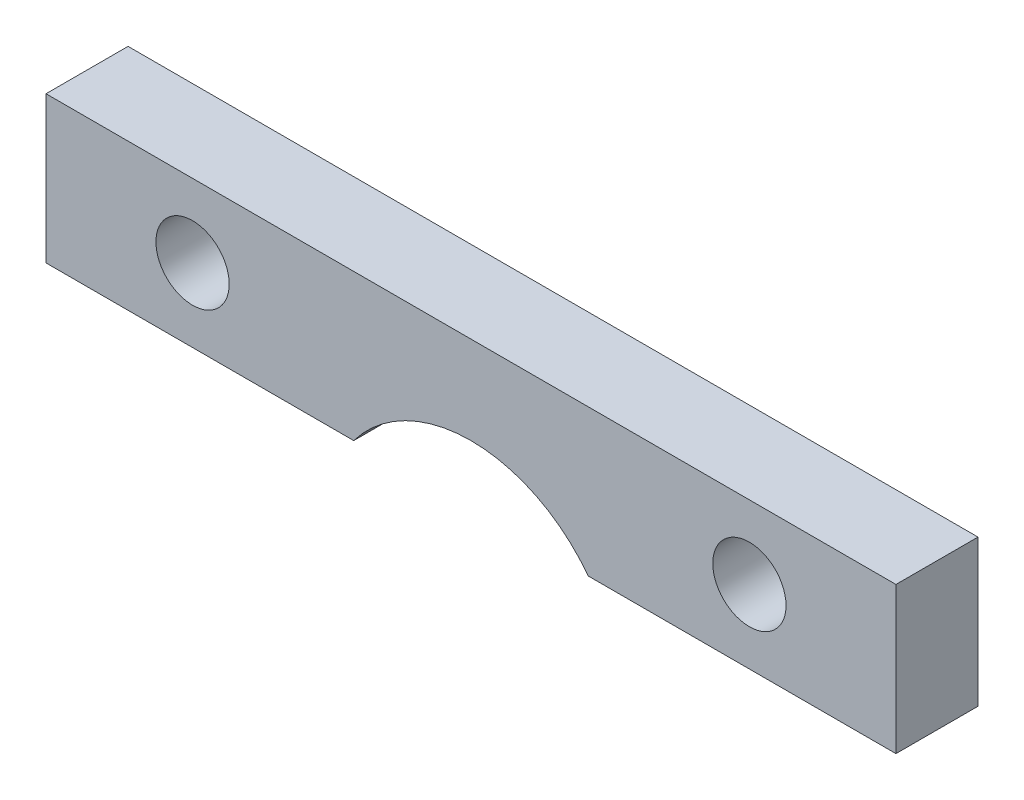
ISO-10303-21;
HEADER;
FILE_DESCRIPTION(('STEP AP214'),'2;1');
FILE_NAME('part.step','',(''),(''),'','','');
FILE_SCHEMA(('AUTOMOTIVE_DESIGN { 1 0 10303 214 1 1 1 1 }'));
ENDSEC;
DATA;
#1=APPLICATION_CONTEXT('core data for automotive mechanical design processes');
#2=APPLICATION_PROTOCOL_DEFINITION('international standard','automotive_design',2000,#1);
#3=PRODUCT_CONTEXT('',#1,'mechanical');
#4=PRODUCT('Part','Part','',(#3));
#5=PRODUCT_RELATED_PRODUCT_CATEGORY('part','',(#4));
#6=PRODUCT_DEFINITION_FORMATION('','',#4);
#7=PRODUCT_DEFINITION_CONTEXT('part definition',#1,'design');
#8=PRODUCT_DEFINITION('design','',#6,#7);
#9=PRODUCT_DEFINITION_SHAPE('','',#8);
#10=(LENGTH_UNIT() NAMED_UNIT(*) SI_UNIT(.MILLI.,.METRE.));
#11=(NAMED_UNIT(*) PLANE_ANGLE_UNIT() SI_UNIT($,.RADIAN.));
#12=(NAMED_UNIT(*) SI_UNIT($,.STERADIAN.) SOLID_ANGLE_UNIT());
#13=UNCERTAINTY_MEASURE_WITH_UNIT(LENGTH_MEASURE(1.E-05),#10,'distance_accuracy_value','');
#14=(GEOMETRIC_REPRESENTATION_CONTEXT(3) GLOBAL_UNCERTAINTY_ASSIGNED_CONTEXT((#13)) GLOBAL_UNIT_ASSIGNED_CONTEXT((#10,
#11,#12)) REPRESENTATION_CONTEXT('',''));
#15=CARTESIAN_POINT('',(0.,0.,0.));
#16=DIRECTION('',(0.,0.,1.));
#17=DIRECTION('',(1.,0.,0.));
#18=AXIS2_PLACEMENT_3D('',#15,#16,#17);
#19=CARTESIAN_POINT('',(36.83,-7.62,7.112));
#20=DIRECTION('',(0.,0.,1.));
#21=DIRECTION('',(1.,0.,0.));
#22=AXIS2_PLACEMENT_3D('',#19,#20,#21);
#23=PLANE('',#22);
#24=CARTESIAN_POINT('',(12.7,6.35,7.112));
#25=DIRECTION('',(0.,0.,1.));
#26=DIRECTION('',(1.,0.,0.));
#27=AXIS2_PLACEMENT_3D('',#24,#25,#26);
#28=CIRCLE('',#27,3.175);
#29=CARTESIAN_POINT('',(15.875,6.35,7.112));
#30=VERTEX_POINT('',#29);
#31=EDGE_CURVE('E140',#30,#30,#28,.T.);
#32=ORIENTED_EDGE('',*,*,#31,.F.);
#33=EDGE_LOOP('',(#32));
#34=FACE_BOUND('',#33,.T.);
#35=DIRECTION('',(0.,-1.,0.));
#36=VECTOR('',#35,1.);
#37=CARTESIAN_POINT('',(0.,0.,7.112));
#38=LINE('',#37,#36);
#39=CARTESIAN_POINT('',(0.,12.7,7.112));
#40=VERTEX_POINT('',#39);
#41=CARTESIAN_POINT('',(0.,0.,7.112));
#42=VERTEX_POINT('',#41);
#43=EDGE_CURVE('E152',#40,#42,#38,.T.);
#44=ORIENTED_EDGE('',*,*,#43,.T.);
#45=DIRECTION('',(1.,0.,0.));
#46=VECTOR('',#45,1.);
#47=CARTESIAN_POINT('',(0.,0.,7.112));
#48=LINE('',#47,#46);
#49=CARTESIAN_POINT('',(26.67,0.,7.112));
#50=VERTEX_POINT('',#49);
#51=EDGE_CURVE('E100',#42,#50,#48,.T.);
#52=ORIENTED_EDGE('',*,*,#51,.T.);
#53=CARTESIAN_POINT('',(36.83,-7.62,7.112));
#54=DIRECTION('',(0.,0.,-1.));
#55=DIRECTION('',(1.,0.,0.));
#56=AXIS2_PLACEMENT_3D('',#53,#54,#55);
#57=CIRCLE('',#56,12.7);
#58=CARTESIAN_POINT('',(46.99,0.,7.112));
#59=VERTEX_POINT('',#58);
#60=EDGE_CURVE('E113',#50,#59,#57,.T.);
#61=ORIENTED_EDGE('',*,*,#60,.T.);
#62=DIRECTION('',(1.,0.,0.));
#63=VECTOR('',#62,1.);
#64=CARTESIAN_POINT('',(46.99,0.,7.112));
#65=LINE('',#64,#63);
#66=CARTESIAN_POINT('',(73.66,0.,7.112));
#67=VERTEX_POINT('',#66);
#68=EDGE_CURVE('E107',#59,#67,#65,.T.);
#69=ORIENTED_EDGE('',*,*,#68,.T.);
#70=DIRECTION('',(0.,1.,0.));
#71=VECTOR('',#70,1.);
#72=CARTESIAN_POINT('',(73.66,0.,7.112));
#73=LINE('',#72,#71);
#74=CARTESIAN_POINT('',(73.66,12.7,7.112));
#75=VERTEX_POINT('',#74);
#76=EDGE_CURVE('E111',#67,#75,#73,.T.);
#77=ORIENTED_EDGE('',*,*,#76,.T.);
#78=DIRECTION('',(-1.,0.,0.));
#79=VECTOR('',#78,1.);
#80=CARTESIAN_POINT('',(0.,12.7,7.112));
#81=LINE('',#80,#79);
#82=EDGE_CURVE('E63',#75,#40,#81,.T.);
#83=ORIENTED_EDGE('',*,*,#82,.T.);
#84=EDGE_LOOP('',(#44,#52,#61,#69,#77,#83));
#85=FACE_BOUND('',#84,.T.);
#86=CARTESIAN_POINT('',(60.96,6.35,7.112));
#87=DIRECTION('',(0.,0.,1.));
#88=DIRECTION('',(1.,0.,0.));
#89=AXIS2_PLACEMENT_3D('',#86,#87,#88);
#90=CIRCLE('',#89,3.175);
#91=CARTESIAN_POINT('',(64.135,6.35,7.112));
#92=VERTEX_POINT('',#91);
#93=EDGE_CURVE('E198',#92,#92,#90,.T.);
#94=ORIENTED_EDGE('',*,*,#93,.F.);
#95=EDGE_LOOP('',(#94));
#96=FACE_BOUND('',#95,.T.);
#97=ADVANCED_FACE('F45',(#34,#85,#96),#23,.T.);
#98=CARTESIAN_POINT('',(36.83,-7.62,0.));
#99=DIRECTION('',(0.,0.,1.));
#100=DIRECTION('',(1.,0.,0.));
#101=AXIS2_PLACEMENT_3D('',#98,#99,#100);
#102=PLANE('',#101);
#103=DIRECTION('',(0.,-1.,0.));
#104=VECTOR('',#103,1.);
#105=CARTESIAN_POINT('',(0.,0.,0.));
#106=LINE('',#105,#104);
#107=CARTESIAN_POINT('',(0.,12.7,0.));
#108=VERTEX_POINT('',#107);
#109=CARTESIAN_POINT('',(0.,0.,0.));
#110=VERTEX_POINT('',#109);
#111=EDGE_CURVE('E135',#108,#110,#106,.T.);
#112=ORIENTED_EDGE('',*,*,#111,.F.);
#113=DIRECTION('',(-1.,0.,0.));
#114=VECTOR('',#113,1.);
#115=CARTESIAN_POINT('',(0.,12.7,0.));
#116=LINE('',#115,#114);
#117=CARTESIAN_POINT('',(73.66,12.7,0.));
#118=VERTEX_POINT('',#117);
#119=EDGE_CURVE('E92',#118,#108,#116,.T.);
#120=ORIENTED_EDGE('',*,*,#119,.F.);
#121=DIRECTION('',(0.,1.,0.));
#122=VECTOR('',#121,1.);
#123=CARTESIAN_POINT('',(73.66,0.,0.));
#124=LINE('',#123,#122);
#125=CARTESIAN_POINT('',(73.66,0.,0.));
#126=VERTEX_POINT('',#125);
#127=EDGE_CURVE('E86',#126,#118,#124,.T.);
#128=ORIENTED_EDGE('',*,*,#127,.F.);
#129=DIRECTION('',(1.,0.,0.));
#130=VECTOR('',#129,1.);
#131=CARTESIAN_POINT('',(46.99,0.,0.));
#132=LINE('',#131,#130);
#133=CARTESIAN_POINT('',(46.99,0.,0.));
#134=VERTEX_POINT('',#133);
#135=EDGE_CURVE('E122',#134,#126,#132,.T.);
#136=ORIENTED_EDGE('',*,*,#135,.F.);
#137=CARTESIAN_POINT('',(36.83,-7.62,0.));
#138=DIRECTION('',(0.,0.,-1.));
#139=DIRECTION('',(1.,0.,0.));
#140=AXIS2_PLACEMENT_3D('',#137,#138,#139);
#141=CIRCLE('',#140,12.7);
#142=CARTESIAN_POINT('',(26.67,0.,0.));
#143=VERTEX_POINT('',#142);
#144=EDGE_CURVE('E143',#143,#134,#141,.T.);
#145=ORIENTED_EDGE('',*,*,#144,.F.);
#146=DIRECTION('',(1.,0.,0.));
#147=VECTOR('',#146,1.);
#148=CARTESIAN_POINT('',(0.,0.,0.));
#149=LINE('',#148,#147);
#150=EDGE_CURVE('E139',#110,#143,#149,.T.);
#151=ORIENTED_EDGE('',*,*,#150,.F.);
#152=EDGE_LOOP('',(#112,#120,#128,#136,#145,#151));
#153=FACE_BOUND('',#152,.T.);
#154=CARTESIAN_POINT('',(12.7,6.35,0.));
#155=DIRECTION('',(0.,0.,1.));
#156=DIRECTION('',(1.,0.,0.));
#157=AXIS2_PLACEMENT_3D('',#154,#155,#156);
#158=CIRCLE('',#157,3.175);
#159=CARTESIAN_POINT('',(15.875,6.35,0.));
#160=VERTEX_POINT('',#159);
#161=EDGE_CURVE('E206',#160,#160,#158,.T.);
#162=ORIENTED_EDGE('',*,*,#161,.T.);
#163=EDGE_LOOP('',(#162));
#164=FACE_BOUND('',#163,.T.);
#165=CARTESIAN_POINT('',(60.96,6.35,0.));
#166=DIRECTION('',(0.,0.,1.));
#167=DIRECTION('',(1.,0.,0.));
#168=AXIS2_PLACEMENT_3D('',#165,#166,#167);
#169=CIRCLE('',#168,3.175);
#170=CARTESIAN_POINT('',(64.135,6.35,0.));
#171=VERTEX_POINT('',#170);
#172=EDGE_CURVE('E201',#171,#171,#169,.T.);
#173=ORIENTED_EDGE('',*,*,#172,.T.);
#174=EDGE_LOOP('',(#173));
#175=FACE_BOUND('',#174,.T.);
#176=ADVANCED_FACE('F165',(#153,#164,#175),#102,.F.);
#177=CARTESIAN_POINT('',(0.,0.,7.112));
#178=DIRECTION('',(1.,0.,0.));
#179=DIRECTION('',(0.,0.,-1.));
#180=AXIS2_PLACEMENT_3D('',#177,#178,#179);
#181=PLANE('',#180);
#182=ORIENTED_EDGE('',*,*,#111,.T.);
#183=DIRECTION('',(0.,0.,-1.));
#184=VECTOR('',#183,1.);
#185=CARTESIAN_POINT('',(0.,0.,7.112));
#186=LINE('',#185,#184);
#187=EDGE_CURVE('E11',#42,#110,#186,.T.);
#188=ORIENTED_EDGE('',*,*,#187,.F.);
#189=ORIENTED_EDGE('',*,*,#43,.F.);
#190=DIRECTION('',(0.,0.,-1.));
#191=VECTOR('',#190,1.);
#192=CARTESIAN_POINT('',(0.,12.7,7.112));
#193=LINE('',#192,#191);
#194=EDGE_CURVE('E131',#40,#108,#193,.T.);
#195=ORIENTED_EDGE('',*,*,#194,.T.);
#196=EDGE_LOOP('',(#182,#188,#189,#195));
#197=FACE_BOUND('',#196,.T.);
#198=ADVANCED_FACE('F47',(#197),#181,.F.);
#199=CARTESIAN_POINT('',(0.,0.,7.112));
#200=DIRECTION('',(0.,1.,0.));
#201=DIRECTION('',(0.,0.,1.));
#202=AXIS2_PLACEMENT_3D('',#199,#200,#201);
#203=PLANE('',#202);
#204=ORIENTED_EDGE('',*,*,#150,.T.);
#205=DIRECTION('',(0.,0.,-1.));
#206=VECTOR('',#205,1.);
#207=CARTESIAN_POINT('',(26.67,0.,7.112));
#208=LINE('',#207,#206);
#209=EDGE_CURVE('E55',#50,#143,#208,.T.);
#210=ORIENTED_EDGE('',*,*,#209,.F.);
#211=ORIENTED_EDGE('',*,*,#51,.F.);
#212=ORIENTED_EDGE('',*,*,#187,.T.);
#213=EDGE_LOOP('',(#204,#210,#211,#212));
#214=FACE_BOUND('',#213,.T.);
#215=ADVANCED_FACE('F254',(#214),#203,.F.);
#216=CARTESIAN_POINT('',(36.83,-7.62,7.112));
#217=DIRECTION('',(0.,0.,-1.));
#218=DIRECTION('',(-1.,0.,0.));
#219=AXIS2_PLACEMENT_3D('',#216,#217,#218);
#220=CYLINDRICAL_SURFACE('',#219,12.7);
#221=ORIENTED_EDGE('',*,*,#144,.T.);
#222=DIRECTION('',(0.,0.,-1.));
#223=VECTOR('',#222,1.);
#224=CARTESIAN_POINT('',(46.99,0.,7.112));
#225=LINE('',#224,#223);
#226=EDGE_CURVE('E124',#59,#134,#225,.T.);
#227=ORIENTED_EDGE('',*,*,#226,.F.);
#228=ORIENTED_EDGE('',*,*,#60,.F.);
#229=ORIENTED_EDGE('',*,*,#209,.T.);
#230=EDGE_LOOP('',(#221,#227,#228,#229));
#231=FACE_BOUND('',#230,.T.);
#232=ADVANCED_FACE('F162',(#231),#220,.F.);
#233=CARTESIAN_POINT('',(46.99,0.,7.112));
#234=DIRECTION('',(0.,1.,0.));
#235=DIRECTION('',(0.,0.,1.));
#236=AXIS2_PLACEMENT_3D('',#233,#234,#235);
#237=PLANE('',#236);
#238=ORIENTED_EDGE('',*,*,#135,.T.);
#239=DIRECTION('',(0.,0.,-1.));
#240=VECTOR('',#239,1.);
#241=CARTESIAN_POINT('',(73.66,0.,7.112));
#242=LINE('',#241,#240);
#243=EDGE_CURVE('E119',#67,#126,#242,.T.);
#244=ORIENTED_EDGE('',*,*,#243,.F.);
#245=ORIENTED_EDGE('',*,*,#68,.F.);
#246=ORIENTED_EDGE('',*,*,#226,.T.);
#247=EDGE_LOOP('',(#238,#244,#245,#246));
#248=FACE_BOUND('',#247,.T.);
#249=ADVANCED_FACE('F120',(#248),#237,.F.);
#250=CARTESIAN_POINT('',(73.66,0.,7.112));
#251=DIRECTION('',(-1.,0.,0.));
#252=DIRECTION('',(0.,0.,1.));
#253=AXIS2_PLACEMENT_3D('',#250,#251,#252);
#254=PLANE('',#253);
#255=ORIENTED_EDGE('',*,*,#127,.T.);
#256=DIRECTION('',(0.,0.,-1.));
#257=VECTOR('',#256,1.);
#258=CARTESIAN_POINT('',(73.66,12.7,7.112));
#259=LINE('',#258,#257);
#260=EDGE_CURVE('E125',#75,#118,#259,.T.);
#261=ORIENTED_EDGE('',*,*,#260,.F.);
#262=ORIENTED_EDGE('',*,*,#76,.F.);
#263=ORIENTED_EDGE('',*,*,#243,.T.);
#264=EDGE_LOOP('',(#255,#261,#262,#263));
#265=FACE_BOUND('',#264,.T.);
#266=ADVANCED_FACE('F127',(#265),#254,.F.);
#267=CARTESIAN_POINT('',(0.,12.7,7.112));
#268=DIRECTION('',(0.,-1.,0.));
#269=DIRECTION('',(0.,0.,-1.));
#270=AXIS2_PLACEMENT_3D('',#267,#268,#269);
#271=PLANE('',#270);
#272=ORIENTED_EDGE('',*,*,#119,.T.);
#273=ORIENTED_EDGE('',*,*,#194,.F.);
#274=ORIENTED_EDGE('',*,*,#82,.F.);
#275=ORIENTED_EDGE('',*,*,#260,.T.);
#276=EDGE_LOOP('',(#272,#273,#274,#275));
#277=FACE_BOUND('',#276,.T.);
#278=ADVANCED_FACE('F170',(#277),#271,.F.);
#279=CARTESIAN_POINT('',(12.7,6.35,7.112));
#280=DIRECTION('',(0.,0.,-1.));
#281=DIRECTION('',(-1.,0.,0.));
#282=AXIS2_PLACEMENT_3D('',#279,#280,#281);
#283=CYLINDRICAL_SURFACE('',#282,3.175);
#284=ORIENTED_EDGE('',*,*,#31,.T.);
#285=EDGE_LOOP('',(#284));
#286=FACE_BOUND('',#285,.T.);
#287=ORIENTED_EDGE('',*,*,#161,.F.);
#288=EDGE_LOOP('',(#287));
#289=FACE_BOUND('',#288,.T.);
#290=ADVANCED_FACE('F172',(#286,#289),#283,.F.);
#291=CARTESIAN_POINT('',(60.96,6.35,7.112));
#292=DIRECTION('',(0.,0.,-1.));
#293=DIRECTION('',(-1.,0.,0.));
#294=AXIS2_PLACEMENT_3D('',#291,#292,#293);
#295=CYLINDRICAL_SURFACE('',#294,3.175);
#296=ORIENTED_EDGE('',*,*,#93,.T.);
#297=EDGE_LOOP('',(#296));
#298=FACE_BOUND('',#297,.T.);
#299=ORIENTED_EDGE('',*,*,#172,.F.);
#300=EDGE_LOOP('',(#299));
#301=FACE_BOUND('',#300,.T.);
#302=ADVANCED_FACE('F178',(#298,#301),#295,.F.);
#303=CLOSED_SHELL('',(#97,#176,#198,#215,#232,#249,#266,#278,#290,#302));
#304=MANIFOLD_SOLID_BREP('B2',#303);
#305=ADVANCED_BREP_SHAPE_REPRESENTATION('',(#18,#304),#14);
#306=SHAPE_DEFINITION_REPRESENTATION(#9,#305);
ENDSEC;
END-ISO-10303-21;
